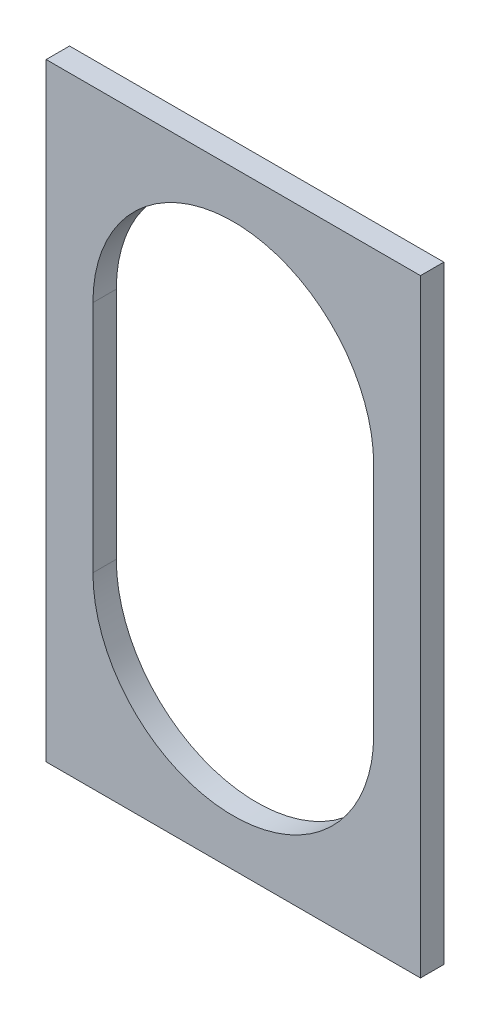
ISO-10303-21;
HEADER;
FILE_DESCRIPTION(('STEP AP214'),'2;1');
FILE_NAME('part.step','',(''),(''),'','','');
FILE_SCHEMA(('AUTOMOTIVE_DESIGN { 1 0 10303 214 1 1 1 1 }'));
ENDSEC;
DATA;
#1=APPLICATION_CONTEXT('core data for automotive mechanical design processes');
#2=APPLICATION_PROTOCOL_DEFINITION('international standard','automotive_design',2000,#1);
#3=PRODUCT_CONTEXT('',#1,'mechanical');
#4=PRODUCT('Part','Part','',(#3));
#5=PRODUCT_RELATED_PRODUCT_CATEGORY('part','',(#4));
#6=PRODUCT_DEFINITION_FORMATION('','',#4);
#7=PRODUCT_DEFINITION_CONTEXT('part definition',#1,'design');
#8=PRODUCT_DEFINITION('design','',#6,#7);
#9=PRODUCT_DEFINITION_SHAPE('','',#8);
#10=(LENGTH_UNIT() NAMED_UNIT(*) SI_UNIT(.MILLI.,.METRE.));
#11=(NAMED_UNIT(*) PLANE_ANGLE_UNIT() SI_UNIT($,.RADIAN.));
#12=(NAMED_UNIT(*) SI_UNIT($,.STERADIAN.) SOLID_ANGLE_UNIT());
#13=UNCERTAINTY_MEASURE_WITH_UNIT(LENGTH_MEASURE(1.E-05),#10,'distance_accuracy_value','');
#14=(GEOMETRIC_REPRESENTATION_CONTEXT(3) GLOBAL_UNCERTAINTY_ASSIGNED_CONTEXT((#13)) GLOBAL_UNIT_ASSIGNED_CONTEXT((#10,
#11,#12)) REPRESENTATION_CONTEXT('',''));
#15=CARTESIAN_POINT('',(0.,0.,0.));
#16=DIRECTION('',(0.,0.,1.));
#17=DIRECTION('',(1.,0.,0.));
#18=AXIS2_PLACEMENT_3D('',#15,#16,#17);
#19=CARTESIAN_POINT('',(0.,0.,5.));
#20=DIRECTION('',(0.,0.,1.));
#21=DIRECTION('',(1.,0.,0.));
#22=AXIS2_PLACEMENT_3D('',#19,#20,#21);
#23=PLANE('',#22);
#24=DIRECTION('',(0.,-1.,0.));
#25=VECTOR('',#24,1.);
#26=CARTESIAN_POINT('',(-40.,-65.,5.));
#27=LINE('',#26,#25);
#28=CARTESIAN_POINT('',(-40.,65.,5.));
#29=VERTEX_POINT('',#28);
#30=CARTESIAN_POINT('',(-40.,-65.,5.));
#31=VERTEX_POINT('',#30);
#32=EDGE_CURVE('E142',#29,#31,#27,.T.);
#33=ORIENTED_EDGE('',*,*,#32,.T.);
#34=DIRECTION('',(1.,0.,0.));
#35=VECTOR('',#34,1.);
#36=CARTESIAN_POINT('',(40.,-65.,5.));
#37=LINE('',#36,#35);
#38=CARTESIAN_POINT('',(40.,-65.,5.));
#39=VERTEX_POINT('',#38);
#40=EDGE_CURVE('E145',#31,#39,#37,.T.);
#41=ORIENTED_EDGE('',*,*,#40,.T.);
#42=DIRECTION('',(0.,1.,0.));
#43=VECTOR('',#42,1.);
#44=CARTESIAN_POINT('',(40.,-65.,5.));
#45=LINE('',#44,#43);
#46=CARTESIAN_POINT('',(40.,65.,5.));
#47=VERTEX_POINT('',#46);
#48=EDGE_CURVE('E148',#39,#47,#45,.T.);
#49=ORIENTED_EDGE('',*,*,#48,.T.);
#50=DIRECTION('',(-1.,0.,0.));
#51=VECTOR('',#50,1.);
#52=CARTESIAN_POINT('',(40.,65.,5.));
#53=LINE('',#52,#51);
#54=EDGE_CURVE('E150',#47,#29,#53,.T.);
#55=ORIENTED_EDGE('',*,*,#54,.T.);
#56=EDGE_LOOP('',(#33,#41,#49,#55));
#57=FACE_BOUND('',#56,.T.);
#58=DIRECTION('',(0.,-1.,0.));
#59=VECTOR('',#58,1.);
#60=CARTESIAN_POINT('',(-30.,25.,5.));
#61=LINE('',#60,#59);
#62=CARTESIAN_POINT('',(-30.,25.,5.));
#63=VERTEX_POINT('',#62);
#64=CARTESIAN_POINT('',(-30.,-25.,5.));
#65=VERTEX_POINT('',#64);
#66=EDGE_CURVE('E114',#63,#65,#61,.T.);
#67=ORIENTED_EDGE('',*,*,#66,.F.);
#68=CARTESIAN_POINT('',(0.,25.,5.));
#69=DIRECTION('',(0.,0.,1.));
#70=DIRECTION('',(1.,0.,0.));
#71=AXIS2_PLACEMENT_3D('',#68,#69,#70);
#72=CIRCLE('',#71,30.);
#73=CARTESIAN_POINT('',(30.,25.,5.));
#74=VERTEX_POINT('',#73);
#75=EDGE_CURVE('E106',#74,#63,#72,.T.);
#76=ORIENTED_EDGE('',*,*,#75,.F.);
#77=DIRECTION('',(0.,1.,0.));
#78=VECTOR('',#77,1.);
#79=CARTESIAN_POINT('',(30.,25.,5.));
#80=LINE('',#79,#78);
#81=CARTESIAN_POINT('',(30.,-25.,5.));
#82=VERTEX_POINT('',#81);
#83=EDGE_CURVE('E128',#82,#74,#80,.T.);
#84=ORIENTED_EDGE('',*,*,#83,.F.);
#85=CARTESIAN_POINT('',(0.,-25.,5.));
#86=DIRECTION('',(0.,0.,1.));
#87=DIRECTION('',(1.,0.,0.));
#88=AXIS2_PLACEMENT_3D('',#85,#86,#87);
#89=CIRCLE('',#88,30.);
#90=EDGE_CURVE('E126',#65,#82,#89,.T.);
#91=ORIENTED_EDGE('',*,*,#90,.F.);
#92=EDGE_LOOP('',(#67,#76,#84,#91));
#93=FACE_BOUND('',#92,.T.);
#94=ADVANCED_FACE('F41',(#57,#93),#23,.T.);
#95=CARTESIAN_POINT('',(0.,0.,0.));
#96=DIRECTION('',(0.,0.,1.));
#97=DIRECTION('',(1.,0.,0.));
#98=AXIS2_PLACEMENT_3D('',#95,#96,#97);
#99=PLANE('',#98);
#100=DIRECTION('',(0.,-1.,0.));
#101=VECTOR('',#100,1.);
#102=CARTESIAN_POINT('',(-40.,-65.,0.));
#103=LINE('',#102,#101);
#104=CARTESIAN_POINT('',(-40.,65.,0.));
#105=VERTEX_POINT('',#104);
#106=CARTESIAN_POINT('',(-40.,-65.,0.));
#107=VERTEX_POINT('',#106);
#108=EDGE_CURVE('E122',#105,#107,#103,.T.);
#109=ORIENTED_EDGE('',*,*,#108,.F.);
#110=DIRECTION('',(-1.,0.,0.));
#111=VECTOR('',#110,1.);
#112=CARTESIAN_POINT('',(40.,65.,0.));
#113=LINE('',#112,#111);
#114=CARTESIAN_POINT('',(40.,65.,0.));
#115=VERTEX_POINT('',#114);
#116=EDGE_CURVE('E146',#115,#105,#113,.T.);
#117=ORIENTED_EDGE('',*,*,#116,.F.);
#118=DIRECTION('',(0.,1.,0.));
#119=VECTOR('',#118,1.);
#120=CARTESIAN_POINT('',(40.,-65.,0.));
#121=LINE('',#120,#119);
#122=CARTESIAN_POINT('',(40.,-65.,0.));
#123=VERTEX_POINT('',#122);
#124=EDGE_CURVE('E157',#123,#115,#121,.T.);
#125=ORIENTED_EDGE('',*,*,#124,.F.);
#126=DIRECTION('',(1.,0.,0.));
#127=VECTOR('',#126,1.);
#128=CARTESIAN_POINT('',(40.,-65.,0.));
#129=LINE('',#128,#127);
#130=EDGE_CURVE('E155',#107,#123,#129,.T.);
#131=ORIENTED_EDGE('',*,*,#130,.F.);
#132=EDGE_LOOP('',(#109,#117,#125,#131));
#133=FACE_BOUND('',#132,.T.);
#134=CARTESIAN_POINT('',(0.,25.,0.));
#135=DIRECTION('',(0.,0.,1.));
#136=DIRECTION('',(1.,0.,0.));
#137=AXIS2_PLACEMENT_3D('',#134,#135,#136);
#138=CIRCLE('',#137,30.);
#139=CARTESIAN_POINT('',(30.,25.,0.));
#140=VERTEX_POINT('',#139);
#141=CARTESIAN_POINT('',(-30.,25.,0.));
#142=VERTEX_POINT('',#141);
#143=EDGE_CURVE('E64',#140,#142,#138,.T.);
#144=ORIENTED_EDGE('',*,*,#143,.T.);
#145=DIRECTION('',(0.,-1.,0.));
#146=VECTOR('',#145,1.);
#147=CARTESIAN_POINT('',(-30.,25.,0.));
#148=LINE('',#147,#146);
#149=CARTESIAN_POINT('',(-30.,-25.,0.));
#150=VERTEX_POINT('',#149);
#151=EDGE_CURVE('E121',#142,#150,#148,.T.);
#152=ORIENTED_EDGE('',*,*,#151,.T.);
#153=CARTESIAN_POINT('',(0.,-25.,0.));
#154=DIRECTION('',(0.,0.,1.));
#155=DIRECTION('',(1.,0.,0.));
#156=AXIS2_PLACEMENT_3D('',#153,#154,#155);
#157=CIRCLE('',#156,30.);
#158=CARTESIAN_POINT('',(30.,-25.,0.));
#159=VERTEX_POINT('',#158);
#160=EDGE_CURVE('E134',#150,#159,#157,.T.);
#161=ORIENTED_EDGE('',*,*,#160,.T.);
#162=DIRECTION('',(0.,1.,0.));
#163=VECTOR('',#162,1.);
#164=CARTESIAN_POINT('',(30.,25.,0.));
#165=LINE('',#164,#163);
#166=EDGE_CURVE('E115',#159,#140,#165,.T.);
#167=ORIENTED_EDGE('',*,*,#166,.T.);
#168=EDGE_LOOP('',(#144,#152,#161,#167));
#169=FACE_BOUND('',#168,.T.);
#170=ADVANCED_FACE('F175',(#133,#169),#99,.F.);
#171=CARTESIAN_POINT('',(-40.,-65.,5.));
#172=DIRECTION('',(1.,0.,0.));
#173=DIRECTION('',(0.,0.,-1.));
#174=AXIS2_PLACEMENT_3D('',#171,#172,#173);
#175=PLANE('',#174);
#176=ORIENTED_EDGE('',*,*,#108,.T.);
#177=DIRECTION('',(0.,0.,-1.));
#178=VECTOR('',#177,1.);
#179=CARTESIAN_POINT('',(-40.,-65.,5.));
#180=LINE('',#179,#178);
#181=EDGE_CURVE('E11',#31,#107,#180,.T.);
#182=ORIENTED_EDGE('',*,*,#181,.F.);
#183=ORIENTED_EDGE('',*,*,#32,.F.);
#184=DIRECTION('',(0.,0.,-1.));
#185=VECTOR('',#184,1.);
#186=CARTESIAN_POINT('',(-40.,65.,5.));
#187=LINE('',#186,#185);
#188=EDGE_CURVE('E152',#29,#105,#187,.T.);
#189=ORIENTED_EDGE('',*,*,#188,.T.);
#190=EDGE_LOOP('',(#176,#182,#183,#189));
#191=FACE_BOUND('',#190,.T.);
#192=ADVANCED_FACE('F43',(#191),#175,.F.);
#193=CARTESIAN_POINT('',(40.,-65.,5.));
#194=DIRECTION('',(0.,1.,0.));
#195=DIRECTION('',(0.,0.,1.));
#196=AXIS2_PLACEMENT_3D('',#193,#194,#195);
#197=PLANE('',#196);
#198=ORIENTED_EDGE('',*,*,#130,.T.);
#199=DIRECTION('',(0.,0.,-1.));
#200=VECTOR('',#199,1.);
#201=CARTESIAN_POINT('',(40.,-65.,5.));
#202=LINE('',#201,#200);
#203=EDGE_CURVE('E49',#39,#123,#202,.T.);
#204=ORIENTED_EDGE('',*,*,#203,.F.);
#205=ORIENTED_EDGE('',*,*,#40,.F.);
#206=ORIENTED_EDGE('',*,*,#181,.T.);
#207=EDGE_LOOP('',(#198,#204,#205,#206));
#208=FACE_BOUND('',#207,.T.);
#209=ADVANCED_FACE('F185',(#208),#197,.F.);
#210=CARTESIAN_POINT('',(40.,-65.,5.));
#211=DIRECTION('',(-1.,0.,0.));
#212=DIRECTION('',(0.,-1.,0.));
#213=AXIS2_PLACEMENT_3D('',#210,#211,#212);
#214=PLANE('',#213);
#215=ORIENTED_EDGE('',*,*,#124,.T.);
#216=DIRECTION('',(0.,0.,-1.));
#217=VECTOR('',#216,1.);
#218=CARTESIAN_POINT('',(40.,65.,5.));
#219=LINE('',#218,#217);
#220=EDGE_CURVE('E162',#47,#115,#219,.T.);
#221=ORIENTED_EDGE('',*,*,#220,.F.);
#222=ORIENTED_EDGE('',*,*,#48,.F.);
#223=ORIENTED_EDGE('',*,*,#203,.T.);
#224=EDGE_LOOP('',(#215,#221,#222,#223));
#225=FACE_BOUND('',#224,.T.);
#226=ADVANCED_FACE('F169',(#225),#214,.F.);
#227=CARTESIAN_POINT('',(40.,65.,5.));
#228=DIRECTION('',(0.,-1.,0.));
#229=DIRECTION('',(0.,0.,-1.));
#230=AXIS2_PLACEMENT_3D('',#227,#228,#229);
#231=PLANE('',#230);
#232=ORIENTED_EDGE('',*,*,#116,.T.);
#233=ORIENTED_EDGE('',*,*,#188,.F.);
#234=ORIENTED_EDGE('',*,*,#54,.F.);
#235=ORIENTED_EDGE('',*,*,#220,.T.);
#236=EDGE_LOOP('',(#232,#233,#234,#235));
#237=FACE_BOUND('',#236,.T.);
#238=ADVANCED_FACE('F179',(#237),#231,.F.);
#239=CARTESIAN_POINT('',(0.,25.,5.));
#240=DIRECTION('',(0.,0.,-1.));
#241=DIRECTION('',(-1.,0.,0.));
#242=AXIS2_PLACEMENT_3D('',#239,#240,#241);
#243=CYLINDRICAL_SURFACE('',#242,30.);
#244=ORIENTED_EDGE('',*,*,#143,.F.);
#245=DIRECTION('',(0.,0.,-1.));
#246=VECTOR('',#245,1.);
#247=CARTESIAN_POINT('',(30.,25.,5.));
#248=LINE('',#247,#246);
#249=EDGE_CURVE('E110',#74,#140,#248,.T.);
#250=ORIENTED_EDGE('',*,*,#249,.F.);
#251=ORIENTED_EDGE('',*,*,#75,.T.);
#252=DIRECTION('',(0.,0.,-1.));
#253=VECTOR('',#252,1.);
#254=CARTESIAN_POINT('',(-30.,25.,5.));
#255=LINE('',#254,#253);
#256=EDGE_CURVE('E109',#63,#142,#255,.T.);
#257=ORIENTED_EDGE('',*,*,#256,.T.);
#258=EDGE_LOOP('',(#244,#250,#251,#257));
#259=FACE_BOUND('',#258,.T.);
#260=ADVANCED_FACE('F108',(#259),#243,.F.);
#261=CARTESIAN_POINT('',(-30.,25.,5.));
#262=DIRECTION('',(1.,0.,0.));
#263=DIRECTION('',(0.,0.,-1.));
#264=AXIS2_PLACEMENT_3D('',#261,#262,#263);
#265=PLANE('',#264);
#266=ORIENTED_EDGE('',*,*,#151,.F.);
#267=ORIENTED_EDGE('',*,*,#256,.F.);
#268=ORIENTED_EDGE('',*,*,#66,.T.);
#269=DIRECTION('',(0.,0.,-1.));
#270=VECTOR('',#269,1.);
#271=CARTESIAN_POINT('',(-30.,-25.,5.));
#272=LINE('',#271,#270);
#273=EDGE_CURVE('E123',#65,#150,#272,.T.);
#274=ORIENTED_EDGE('',*,*,#273,.T.);
#275=EDGE_LOOP('',(#266,#267,#268,#274));
#276=FACE_BOUND('',#275,.T.);
#277=ADVANCED_FACE('F118',(#276),#265,.T.);
#278=CARTESIAN_POINT('',(0.,-25.,5.));
#279=DIRECTION('',(0.,0.,-1.));
#280=DIRECTION('',(-1.,0.,0.));
#281=AXIS2_PLACEMENT_3D('',#278,#279,#280);
#282=CYLINDRICAL_SURFACE('',#281,30.);
#283=ORIENTED_EDGE('',*,*,#160,.F.);
#284=ORIENTED_EDGE('',*,*,#273,.F.);
#285=ORIENTED_EDGE('',*,*,#90,.T.);
#286=DIRECTION('',(0.,0.,-1.));
#287=VECTOR('',#286,1.);
#288=CARTESIAN_POINT('',(30.,-25.,5.));
#289=LINE('',#288,#287);
#290=EDGE_CURVE('E56',#82,#159,#289,.T.);
#291=ORIENTED_EDGE('',*,*,#290,.T.);
#292=EDGE_LOOP('',(#283,#284,#285,#291));
#293=FACE_BOUND('',#292,.T.);
#294=ADVANCED_FACE('F208',(#293),#282,.F.);
#295=CARTESIAN_POINT('',(30.,25.,5.));
#296=DIRECTION('',(-1.,0.,0.));
#297=DIRECTION('',(0.,0.,1.));
#298=AXIS2_PLACEMENT_3D('',#295,#296,#297);
#299=PLANE('',#298);
#300=ORIENTED_EDGE('',*,*,#166,.F.);
#301=ORIENTED_EDGE('',*,*,#290,.F.);
#302=ORIENTED_EDGE('',*,*,#83,.T.);
#303=ORIENTED_EDGE('',*,*,#249,.T.);
#304=EDGE_LOOP('',(#300,#301,#302,#303));
#305=FACE_BOUND('',#304,.T.);
#306=ADVANCED_FACE('F212',(#305),#299,.T.);
#307=CLOSED_SHELL('',(#94,#170,#192,#209,#226,#238,#260,#277,#294,#306));
#308=MANIFOLD_SOLID_BREP('B2',#307);
#309=ADVANCED_BREP_SHAPE_REPRESENTATION('',(#18,#308),#14);
#310=SHAPE_DEFINITION_REPRESENTATION(#9,#309);
ENDSEC;
END-ISO-10303-21;
